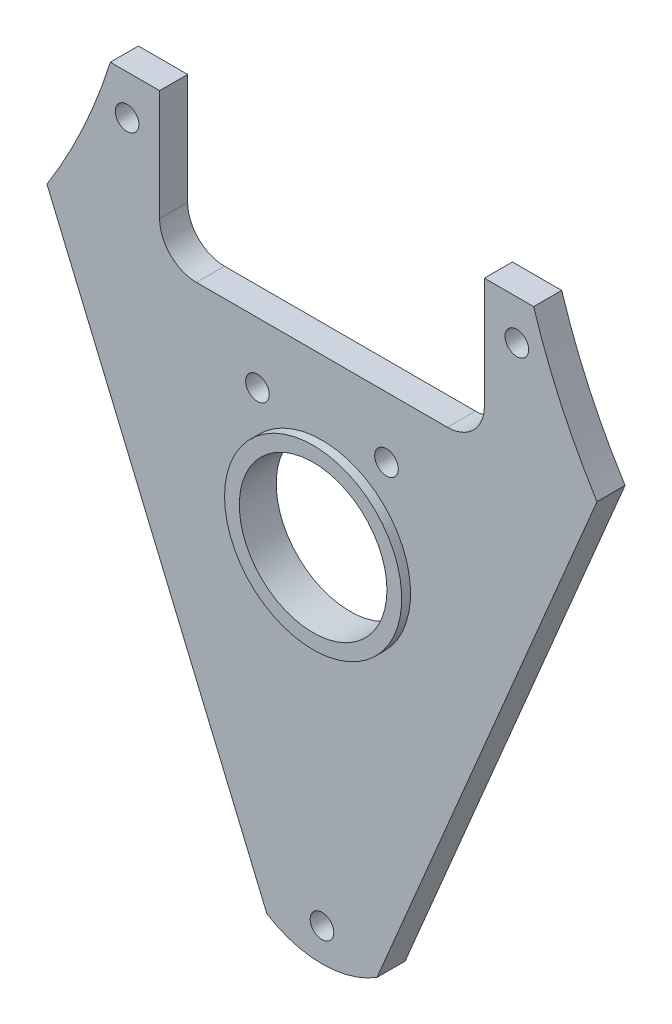
ISO-10303-21;
HEADER;
FILE_DESCRIPTION(('STEP AP214'),'2;1');
FILE_NAME('part.step','',(''),(''),'','','');
FILE_SCHEMA(('AUTOMOTIVE_DESIGN { 1 0 10303 214 1 1 1 1 }'));
ENDSEC;
DATA;
#1=APPLICATION_CONTEXT('core data for automotive mechanical design processes');
#2=APPLICATION_PROTOCOL_DEFINITION('international standard','automotive_design',2000,#1);
#3=PRODUCT_CONTEXT('',#1,'mechanical');
#4=PRODUCT('Part','Part','',(#3));
#5=PRODUCT_RELATED_PRODUCT_CATEGORY('part','',(#4));
#6=PRODUCT_DEFINITION_FORMATION('','',#4);
#7=PRODUCT_DEFINITION_CONTEXT('part definition',#1,'design');
#8=PRODUCT_DEFINITION('design','',#6,#7);
#9=PRODUCT_DEFINITION_SHAPE('','',#8);
#10=(LENGTH_UNIT() NAMED_UNIT(*) SI_UNIT(.MILLI.,.METRE.));
#11=(NAMED_UNIT(*) PLANE_ANGLE_UNIT() SI_UNIT($,.RADIAN.));
#12=(NAMED_UNIT(*) SI_UNIT($,.STERADIAN.) SOLID_ANGLE_UNIT());
#13=UNCERTAINTY_MEASURE_WITH_UNIT(LENGTH_MEASURE(1.E-05),#10,'distance_accuracy_value','');
#14=(GEOMETRIC_REPRESENTATION_CONTEXT(3) GLOBAL_UNCERTAINTY_ASSIGNED_CONTEXT((#13)) GLOBAL_UNIT_ASSIGNED_CONTEXT((#10,
#11,#12)) REPRESENTATION_CONTEXT('',''));
#15=CARTESIAN_POINT('',(0.,0.,0.));
#16=DIRECTION('',(0.,0.,1.));
#17=DIRECTION('',(1.,0.,0.));
#18=AXIS2_PLACEMENT_3D('',#15,#16,#17);
#19=CARTESIAN_POINT('',(0.,0.,2.413));
#20=DIRECTION('',(0.,0.,1.));
#21=DIRECTION('',(1.,0.,0.));
#22=AXIS2_PLACEMENT_3D('',#19,#20,#21);
#23=PLANE('',#22);
#24=CARTESIAN_POINT('',(-16.764,23.241,2.413));
#25=DIRECTION('',(0.,0.,1.));
#26=DIRECTION('',(1.,0.,0.));
#27=AXIS2_PLACEMENT_3D('',#24,#25,#26);
#28=CIRCLE('',#27,1.016);
#29=CARTESIAN_POINT('',(-15.748,23.241,2.413));
#30=VERTEX_POINT('',#29);
#31=EDGE_CURVE('E235',#30,#30,#28,.T.);
#32=ORIENTED_EDGE('',*,*,#31,.F.);
#33=EDGE_LOOP('',(#32));
#34=FACE_BOUND('',#33,.T.);
#35=CARTESIAN_POINT('',(5.5499,8.7376,2.413));
#36=DIRECTION('',(0.,0.,1.));
#37=DIRECTION('',(1.,0.,0.));
#38=AXIS2_PLACEMENT_3D('',#35,#36,#37);
#39=CIRCLE('',#38,1.016);
#40=CARTESIAN_POINT('',(6.5659,8.7376,2.413));
#41=VERTEX_POINT('',#40);
#42=EDGE_CURVE('E256',#41,#41,#39,.T.);
#43=ORIENTED_EDGE('',*,*,#42,.F.);
#44=EDGE_LOOP('',(#43));
#45=FACE_BOUND('',#44,.T.);
#46=CARTESIAN_POINT('',(-5.5499,8.7376,2.413));
#47=DIRECTION('',(0.,0.,1.));
#48=DIRECTION('',(1.,0.,0.));
#49=AXIS2_PLACEMENT_3D('',#46,#47,#48);
#50=CIRCLE('',#49,1.016);
#51=CARTESIAN_POINT('',(-4.5339,8.7376,2.413));
#52=VERTEX_POINT('',#51);
#53=EDGE_CURVE('E253',#52,#52,#50,.T.);
#54=ORIENTED_EDGE('',*,*,#53,.F.);
#55=EDGE_LOOP('',(#54));
#56=FACE_BOUND('',#55,.T.);
#57=CARTESIAN_POINT('',(0.,-28.575,2.413));
#58=DIRECTION('',(0.,0.,1.));
#59=DIRECTION('',(1.,0.,0.));
#60=AXIS2_PLACEMENT_3D('',#57,#58,#59);
#61=CIRCLE('',#60,1.016);
#62=CARTESIAN_POINT('',(1.016,-28.575,2.413));
#63=VERTEX_POINT('',#62);
#64=EDGE_CURVE('E249',#63,#63,#61,.T.);
#65=ORIENTED_EDGE('',*,*,#64,.F.);
#66=EDGE_LOOP('',(#65));
#67=FACE_BOUND('',#66,.T.);
#68=CARTESIAN_POINT('',(16.764,23.241,2.413));
#69=DIRECTION('',(0.,0.,1.));
#70=DIRECTION('',(1.,0.,0.));
#71=AXIS2_PLACEMENT_3D('',#68,#69,#70);
#72=CIRCLE('',#71,1.016);
#73=CARTESIAN_POINT('',(17.78,23.241,2.413));
#74=VERTEX_POINT('',#73);
#75=EDGE_CURVE('E252',#74,#74,#72,.T.);
#76=ORIENTED_EDGE('',*,*,#75,.F.);
#77=EDGE_LOOP('',(#76));
#78=FACE_BOUND('',#77,.T.);
#79=CARTESIAN_POINT('',(0.,0.,2.413));
#80=DIRECTION('',(0.,0.,1.));
#81=DIRECTION('',(1.,0.,0.));
#82=AXIS2_PLACEMENT_3D('',#79,#80,#81);
#83=CIRCLE('',#82,7.62);
#84=CARTESIAN_POINT('',(-7.62,0.,2.413));
#85=VERTEX_POINT('',#84);
#86=EDGE_CURVE('E226',#85,#85,#83,.T.);
#87=ORIENTED_EDGE('',*,*,#86,.F.);
#88=EDGE_LOOP('',(#87));
#89=FACE_BOUND('',#88,.T.);
#90=DIRECTION('',(0.,1.,0.));
#91=VECTOR('',#90,1.);
#92=CARTESIAN_POINT('',(-13.97,0.,2.413));
#93=LINE('',#92,#91);
#94=CARTESIAN_POINT('',(-13.97,17.145,2.413));
#95=VERTEX_POINT('',#94);
#96=CARTESIAN_POINT('',(-13.97,26.67,2.413));
#97=VERTEX_POINT('',#96);
#98=EDGE_CURVE('E173',#95,#97,#93,.T.);
#99=ORIENTED_EDGE('',*,*,#98,.T.);
#100=DIRECTION('',(-1.,0.,0.));
#101=VECTOR('',#100,1.);
#102=CARTESIAN_POINT('',(0.,26.67,2.413));
#103=LINE('',#102,#101);
#104=CARTESIAN_POINT('',(-18.2073286304664,26.67,2.413));
#105=VERTEX_POINT('',#104);
#106=EDGE_CURVE('E220',#97,#105,#103,.T.);
#107=ORIENTED_EDGE('',*,*,#106,.T.);
#108=CARTESIAN_POINT('',(-66.675,41.8859400634628,2.413));
#109=DIRECTION('',(0.,0.,1.));
#110=DIRECTION('',(1.,0.,0.));
#111=AXIS2_PLACEMENT_3D('',#108,#109,#110);
#112=CIRCLE('',#111,50.8);
#113=CARTESIAN_POINT('',(-23.6588709677419,14.8627529257449,2.413));
#114=VERTEX_POINT('',#113);
#115=EDGE_CURVE('E217',#105,#114,#112,.F.);
#116=ORIENTED_EDGE('',*,*,#115,.T.);
#117=DIRECTION('',(0.388341695242072,-0.921515451707954,0.));
#118=VECTOR('',#117,1.);
#119=CARTESIAN_POINT('',(-14.7720663961643,-6.22519057698116,2.413));
#120=LINE('',#119,#118);
#121=CARTESIAN_POINT('',(-4.73782513208841,-30.0359440559441,2.413));
#122=VERTEX_POINT('',#121);
#123=EDGE_CURVE('E214',#114,#122,#120,.T.);
#124=ORIENTED_EDGE('',*,*,#123,.T.);
#125=CARTESIAN_POINT('',(0.,-22.5136363636364,2.413));
#126=DIRECTION('',(0.,0.,1.));
#127=DIRECTION('',(1.,0.,0.));
#128=AXIS2_PLACEMENT_3D('',#125,#126,#127);
#129=CIRCLE('',#128,8.88999999999999);
#130=CARTESIAN_POINT('',(4.7378251320884,-30.0359440559441,2.413));
#131=VERTEX_POINT('',#130);
#132=EDGE_CURVE('E211',#122,#131,#129,.T.);
#133=ORIENTED_EDGE('',*,*,#132,.T.);
#134=DIRECTION('',(0.388341695242072,0.921515451707954,0.));
#135=VECTOR('',#134,1.);
#136=CARTESIAN_POINT('',(14.7720663961643,-6.22519057698116,2.413));
#137=LINE('',#136,#135);
#138=CARTESIAN_POINT('',(23.6588709677419,14.8627529257449,2.413));
#139=VERTEX_POINT('',#138);
#140=EDGE_CURVE('E208',#131,#139,#137,.T.);
#141=ORIENTED_EDGE('',*,*,#140,.T.);
#142=CARTESIAN_POINT('',(66.675,41.8859400634628,2.413));
#143=DIRECTION('',(0.,0.,1.));
#144=DIRECTION('',(1.,0.,0.));
#145=AXIS2_PLACEMENT_3D('',#142,#143,#144);
#146=CIRCLE('',#145,50.8);
#147=CARTESIAN_POINT('',(18.2073286304664,26.67,2.413));
#148=VERTEX_POINT('',#147);
#149=EDGE_CURVE('E205',#139,#148,#146,.F.);
#150=ORIENTED_EDGE('',*,*,#149,.T.);
#151=DIRECTION('',(-1.,0.,0.));
#152=VECTOR('',#151,1.);
#153=CARTESIAN_POINT('',(0.,26.67,2.413));
#154=LINE('',#153,#152);
#155=CARTESIAN_POINT('',(13.97,26.67,2.413));
#156=VERTEX_POINT('',#155);
#157=EDGE_CURVE('E202',#148,#156,#154,.T.);
#158=ORIENTED_EDGE('',*,*,#157,.T.);
#159=DIRECTION('',(0.,-1.,0.));
#160=VECTOR('',#159,1.);
#161=CARTESIAN_POINT('',(13.97,0.,2.413));
#162=LINE('',#161,#160);
#163=CARTESIAN_POINT('',(13.97,17.145,2.413));
#164=VERTEX_POINT('',#163);
#165=EDGE_CURVE('E199',#156,#164,#162,.T.);
#166=ORIENTED_EDGE('',*,*,#165,.T.);
#167=CARTESIAN_POINT('',(10.795,17.145,2.413));
#168=DIRECTION('',(0.,0.,1.));
#169=DIRECTION('',(1.,0.,0.));
#170=AXIS2_PLACEMENT_3D('',#167,#168,#169);
#171=CIRCLE('',#170,3.175);
#172=CARTESIAN_POINT('',(10.795,13.97,2.413));
#173=VERTEX_POINT('',#172);
#174=EDGE_CURVE('E196',#164,#173,#171,.F.);
#175=ORIENTED_EDGE('',*,*,#174,.T.);
#176=DIRECTION('',(-1.,0.,0.));
#177=VECTOR('',#176,1.);
#178=CARTESIAN_POINT('',(0.,13.97,2.413));
#179=LINE('',#178,#177);
#180=CARTESIAN_POINT('',(-10.795,13.97,2.413));
#181=VERTEX_POINT('',#180);
#182=EDGE_CURVE('E194',#173,#181,#179,.T.);
#183=ORIENTED_EDGE('',*,*,#182,.T.);
#184=CARTESIAN_POINT('',(-10.795,17.145,2.413));
#185=DIRECTION('',(0.,0.,1.));
#186=DIRECTION('',(1.,0.,0.));
#187=AXIS2_PLACEMENT_3D('',#184,#185,#186);
#188=CIRCLE('',#187,3.175);
#189=EDGE_CURVE('E126',#181,#95,#188,.F.);
#190=ORIENTED_EDGE('',*,*,#189,.T.);
#191=EDGE_LOOP('',(#99,#107,#116,#124,#133,#141,#150,#158,#166,#175,#183,#190));
#192=FACE_BOUND('',#191,.T.);
#193=ADVANCED_FACE('F32',(#34,#45,#56,#67,#78,#89,#192),#23,.T.);
#194=CARTESIAN_POINT('',(0.,0.,0.));
#195=DIRECTION('',(0.,0.,1.));
#196=DIRECTION('',(1.,0.,0.));
#197=AXIS2_PLACEMENT_3D('',#194,#195,#196);
#198=PLANE('',#197);
#199=CARTESIAN_POINT('',(-16.764,23.241,0.));
#200=DIRECTION('',(0.,0.,1.));
#201=DIRECTION('',(1.,0.,0.));
#202=AXIS2_PLACEMENT_3D('',#199,#200,#201);
#203=CIRCLE('',#202,1.016);
#204=CARTESIAN_POINT('',(-15.748,23.241,0.));
#205=VERTEX_POINT('',#204);
#206=EDGE_CURVE('E36',#205,#205,#203,.T.);
#207=ORIENTED_EDGE('',*,*,#206,.T.);
#208=EDGE_LOOP('',(#207));
#209=FACE_BOUND('',#208,.T.);
#210=CARTESIAN_POINT('',(5.5499,8.7376,0.));
#211=DIRECTION('',(0.,0.,1.));
#212=DIRECTION('',(1.,0.,0.));
#213=AXIS2_PLACEMENT_3D('',#210,#211,#212);
#214=CIRCLE('',#213,1.016);
#215=CARTESIAN_POINT('',(6.5659,8.7376,0.));
#216=VERTEX_POINT('',#215);
#217=EDGE_CURVE('E240',#216,#216,#214,.T.);
#218=ORIENTED_EDGE('',*,*,#217,.T.);
#219=EDGE_LOOP('',(#218));
#220=FACE_BOUND('',#219,.T.);
#221=CARTESIAN_POINT('',(-5.5499,8.7376,0.));
#222=DIRECTION('',(0.,0.,1.));
#223=DIRECTION('',(1.,0.,0.));
#224=AXIS2_PLACEMENT_3D('',#221,#222,#223);
#225=CIRCLE('',#224,1.016);
#226=CARTESIAN_POINT('',(-4.5339,8.7376,0.));
#227=VERTEX_POINT('',#226);
#228=EDGE_CURVE('E238',#227,#227,#225,.T.);
#229=ORIENTED_EDGE('',*,*,#228,.T.);
#230=EDGE_LOOP('',(#229));
#231=FACE_BOUND('',#230,.T.);
#232=CARTESIAN_POINT('',(0.,-28.575,0.));
#233=DIRECTION('',(0.,0.,1.));
#234=DIRECTION('',(1.,0.,0.));
#235=AXIS2_PLACEMENT_3D('',#232,#233,#234);
#236=CIRCLE('',#235,1.016);
#237=CARTESIAN_POINT('',(1.016,-28.575,0.));
#238=VERTEX_POINT('',#237);
#239=EDGE_CURVE('E234',#238,#238,#236,.T.);
#240=ORIENTED_EDGE('',*,*,#239,.T.);
#241=EDGE_LOOP('',(#240));
#242=FACE_BOUND('',#241,.T.);
#243=CARTESIAN_POINT('',(16.764,23.241,0.));
#244=DIRECTION('',(0.,0.,1.));
#245=DIRECTION('',(1.,0.,0.));
#246=AXIS2_PLACEMENT_3D('',#243,#244,#245);
#247=CIRCLE('',#246,1.016);
#248=CARTESIAN_POINT('',(17.78,23.241,0.));
#249=VERTEX_POINT('',#248);
#250=EDGE_CURVE('E231',#249,#249,#247,.T.);
#251=ORIENTED_EDGE('',*,*,#250,.T.);
#252=EDGE_LOOP('',(#251));
#253=FACE_BOUND('',#252,.T.);
#254=CARTESIAN_POINT('',(0.,0.,0.));
#255=DIRECTION('',(0.,0.,1.));
#256=DIRECTION('',(1.,0.,0.));
#257=AXIS2_PLACEMENT_3D('',#254,#255,#256);
#258=CIRCLE('',#257,6.35);
#259=CARTESIAN_POINT('',(6.35,0.,0.));
#260=VERTEX_POINT('',#259);
#261=EDGE_CURVE('E11',#260,#260,#258,.T.);
#262=ORIENTED_EDGE('',*,*,#261,.T.);
#263=EDGE_LOOP('',(#262));
#264=FACE_BOUND('',#263,.T.);
#265=DIRECTION('',(1.,0.,0.));
#266=VECTOR('',#265,1.);
#267=CARTESIAN_POINT('',(-13.97,26.67,0.));
#268=LINE('',#267,#266);
#269=CARTESIAN_POINT('',(-18.2073286304664,26.67,0.));
#270=VERTEX_POINT('',#269);
#271=CARTESIAN_POINT('',(-13.97,26.67,0.));
#272=VERTEX_POINT('',#271);
#273=EDGE_CURVE('E145',#270,#272,#268,.T.);
#274=ORIENTED_EDGE('',*,*,#273,.T.);
#275=DIRECTION('',(0.,-1.,0.));
#276=VECTOR('',#275,1.);
#277=CARTESIAN_POINT('',(-13.97,17.145,0.));
#278=LINE('',#277,#276);
#279=CARTESIAN_POINT('',(-13.97,17.145,0.));
#280=VERTEX_POINT('',#279);
#281=EDGE_CURVE('E143',#272,#280,#278,.T.);
#282=ORIENTED_EDGE('',*,*,#281,.T.);
#283=CARTESIAN_POINT('',(-10.795,17.145,0.));
#284=DIRECTION('',(0.,0.,1.));
#285=DIRECTION('',(-1.,0.,0.));
#286=AXIS2_PLACEMENT_3D('',#283,#284,#285);
#287=CIRCLE('',#286,3.175);
#288=CARTESIAN_POINT('',(-10.795,13.97,0.));
#289=VERTEX_POINT('',#288);
#290=EDGE_CURVE('E57',#280,#289,#287,.T.);
#291=ORIENTED_EDGE('',*,*,#290,.T.);
#292=DIRECTION('',(1.,0.,0.));
#293=VECTOR('',#292,1.);
#294=CARTESIAN_POINT('',(-10.795,13.97,0.));
#295=LINE('',#294,#293);
#296=CARTESIAN_POINT('',(10.795,13.97,0.));
#297=VERTEX_POINT('',#296);
#298=EDGE_CURVE('E133',#289,#297,#295,.T.);
#299=ORIENTED_EDGE('',*,*,#298,.T.);
#300=CARTESIAN_POINT('',(10.795,17.145,0.));
#301=DIRECTION('',(0.,0.,1.));
#302=DIRECTION('',(1.,0.,0.));
#303=AXIS2_PLACEMENT_3D('',#300,#301,#302);
#304=CIRCLE('',#303,3.175);
#305=CARTESIAN_POINT('',(13.97,17.145,0.));
#306=VERTEX_POINT('',#305);
#307=EDGE_CURVE('E139',#297,#306,#304,.T.);
#308=ORIENTED_EDGE('',*,*,#307,.T.);
#309=DIRECTION('',(0.,1.,0.));
#310=VECTOR('',#309,1.);
#311=CARTESIAN_POINT('',(13.97,17.145,0.));
#312=LINE('',#311,#310);
#313=CARTESIAN_POINT('',(13.97,26.67,0.));
#314=VERTEX_POINT('',#313);
#315=EDGE_CURVE('E150',#306,#314,#312,.T.);
#316=ORIENTED_EDGE('',*,*,#315,.T.);
#317=DIRECTION('',(1.,0.,0.));
#318=VECTOR('',#317,1.);
#319=CARTESIAN_POINT('',(13.97,26.67,0.));
#320=LINE('',#319,#318);
#321=CARTESIAN_POINT('',(18.2073286304664,26.67,0.));
#322=VERTEX_POINT('',#321);
#323=EDGE_CURVE('E153',#314,#322,#320,.T.);
#324=ORIENTED_EDGE('',*,*,#323,.T.);
#325=CARTESIAN_POINT('',(66.675,41.8859400634628,0.));
#326=DIRECTION('',(0.,0.,1.));
#327=DIRECTION('',(1.,0.,0.));
#328=AXIS2_PLACEMENT_3D('',#325,#326,#327);
#329=CIRCLE('',#328,50.8);
#330=CARTESIAN_POINT('',(23.6588709677419,14.8627529257449,0.));
#331=VERTEX_POINT('',#330);
#332=EDGE_CURVE('E156',#322,#331,#329,.T.);
#333=ORIENTED_EDGE('',*,*,#332,.T.);
#334=DIRECTION('',(-0.388341695242072,-0.921515451707954,0.));
#335=VECTOR('',#334,1.);
#336=CARTESIAN_POINT('',(23.6588709677419,14.8627529257449,0.));
#337=LINE('',#336,#335);
#338=CARTESIAN_POINT('',(4.7378251320884,-30.0359440559441,0.));
#339=VERTEX_POINT('',#338);
#340=EDGE_CURVE('E159',#331,#339,#337,.T.);
#341=ORIENTED_EDGE('',*,*,#340,.T.);
#342=CARTESIAN_POINT('',(0.,-22.5136363636364,0.));
#343=DIRECTION('',(0.,0.,-1.));
#344=DIRECTION('',(-1.,0.,0.));
#345=AXIS2_PLACEMENT_3D('',#342,#343,#344);
#346=CIRCLE('',#345,8.88999999999999);
#347=CARTESIAN_POINT('',(-4.73782513208841,-30.0359440559441,0.));
#348=VERTEX_POINT('',#347);
#349=EDGE_CURVE('E162',#339,#348,#346,.T.);
#350=ORIENTED_EDGE('',*,*,#349,.T.);
#351=DIRECTION('',(-0.388341695242072,0.921515451707954,0.));
#352=VECTOR('',#351,1.);
#353=CARTESIAN_POINT('',(-23.6588709677419,14.8627529257449,0.));
#354=LINE('',#353,#352);
#355=CARTESIAN_POINT('',(-23.6588709677419,14.8627529257449,0.));
#356=VERTEX_POINT('',#355);
#357=EDGE_CURVE('E165',#348,#356,#354,.T.);
#358=ORIENTED_EDGE('',*,*,#357,.T.);
#359=CARTESIAN_POINT('',(-66.675,41.8859400634628,0.));
#360=DIRECTION('',(0.,0.,1.));
#361=DIRECTION('',(-1.,0.,0.));
#362=AXIS2_PLACEMENT_3D('',#359,#360,#361);
#363=CIRCLE('',#362,50.8);
#364=EDGE_CURVE('E168',#356,#270,#363,.T.);
#365=ORIENTED_EDGE('',*,*,#364,.T.);
#366=EDGE_LOOP('',(#274,#282,#291,#299,#308,#316,#324,#333,#341,#350,#358,#365));
#367=FACE_BOUND('',#366,.T.);
#368=ADVANCED_FACE('F34',(#209,#220,#231,#242,#253,#264,#367),#198,.F.);
#369=CARTESIAN_POINT('',(0.,0.,2.413));
#370=DIRECTION('',(0.,0.,-1.));
#371=DIRECTION('',(-1.,0.,0.));
#372=AXIS2_PLACEMENT_3D('',#369,#370,#371);
#373=CYLINDRICAL_SURFACE('',#372,6.35);
#374=ORIENTED_EDGE('',*,*,#261,.F.);
#375=EDGE_LOOP('',(#374));
#376=FACE_BOUND('',#375,.T.);
#377=CARTESIAN_POINT('',(0.,0.,3.175));
#378=DIRECTION('',(0.,0.,1.));
#379=DIRECTION('',(1.,0.,0.));
#380=AXIS2_PLACEMENT_3D('',#377,#378,#379);
#381=CIRCLE('',#380,6.35);
#382=CARTESIAN_POINT('',(6.35,0.,3.175));
#383=VERTEX_POINT('',#382);
#384=EDGE_CURVE('E223',#383,#383,#381,.T.);
#385=ORIENTED_EDGE('',*,*,#384,.T.);
#386=EDGE_LOOP('',(#385));
#387=FACE_BOUND('',#386,.T.);
#388=ADVANCED_FACE('F302',(#376,#387),#373,.F.);
#389=CARTESIAN_POINT('',(0.,0.,3.175));
#390=DIRECTION('',(0.,0.,1.));
#391=DIRECTION('',(1.,0.,0.));
#392=AXIS2_PLACEMENT_3D('',#389,#390,#391);
#393=PLANE('',#392);
#394=CARTESIAN_POINT('',(0.,0.,3.175));
#395=DIRECTION('',(0.,0.,1.));
#396=DIRECTION('',(1.,0.,0.));
#397=AXIS2_PLACEMENT_3D('',#394,#395,#396);
#398=CIRCLE('',#397,7.62);
#399=CARTESIAN_POINT('',(-7.62,0.,3.175));
#400=VERTEX_POINT('',#399);
#401=EDGE_CURVE('E41',#400,#400,#398,.T.);
#402=ORIENTED_EDGE('',*,*,#401,.T.);
#403=EDGE_LOOP('',(#402));
#404=FACE_BOUND('',#403,.T.);
#405=ORIENTED_EDGE('',*,*,#384,.F.);
#406=EDGE_LOOP('',(#405));
#407=FACE_BOUND('',#406,.T.);
#408=ADVANCED_FACE('F299',(#404,#407),#393,.T.);
#409=CARTESIAN_POINT('',(0.,0.,3.175));
#410=DIRECTION('',(0.,0.,-1.));
#411=DIRECTION('',(-1.,0.,0.));
#412=AXIS2_PLACEMENT_3D('',#409,#410,#411);
#413=CYLINDRICAL_SURFACE('',#412,7.62);
#414=CARTESIAN_POINT('',(-7.62,0.,3.175));
#415=CARTESIAN_POINT('',(-7.62,0.,3.1670625));
#416=CARTESIAN_POINT('',(-7.62,0.,3.159125));
#417=CARTESIAN_POINT('',(-7.62,0.,3.14325));
#418=CARTESIAN_POINT('',(-7.62,0.,3.1353125));
#419=CARTESIAN_POINT('',(-7.62,0.,3.1194375));
#420=CARTESIAN_POINT('',(-7.62,0.,3.1115));
#421=CARTESIAN_POINT('',(-7.62,0.,3.095625));
#422=CARTESIAN_POINT('',(-7.62,0.,3.0876875));
#423=CARTESIAN_POINT('',(-7.62,0.,3.0718125));
#424=CARTESIAN_POINT('',(-7.62,0.,3.063875));
#425=CARTESIAN_POINT('',(-7.62,0.,3.048));
#426=CARTESIAN_POINT('',(-7.62,0.,3.0400625));
#427=CARTESIAN_POINT('',(-7.62,0.,3.0241875));
#428=CARTESIAN_POINT('',(-7.62,0.,3.01625));
#429=CARTESIAN_POINT('',(-7.62,0.,3.000375));
#430=CARTESIAN_POINT('',(-7.62,0.,2.9924375));
#431=CARTESIAN_POINT('',(-7.62,0.,2.9765625));
#432=CARTESIAN_POINT('',(-7.62,0.,2.968625));
#433=CARTESIAN_POINT('',(-7.62,0.,2.95275));
#434=CARTESIAN_POINT('',(-7.62,0.,2.9448125));
#435=CARTESIAN_POINT('',(-7.62,0.,2.9289375));
#436=CARTESIAN_POINT('',(-7.62,0.,2.921));
#437=CARTESIAN_POINT('',(-7.62,0.,2.905125));
#438=CARTESIAN_POINT('',(-7.62,0.,2.8971875));
#439=CARTESIAN_POINT('',(-7.62,0.,2.8813125));
#440=CARTESIAN_POINT('',(-7.62,0.,2.873375));
#441=CARTESIAN_POINT('',(-7.62,0.,2.8575));
#442=CARTESIAN_POINT('',(-7.62,0.,2.8495625));
#443=CARTESIAN_POINT('',(-7.62,0.,2.8336875));
#444=CARTESIAN_POINT('',(-7.62,0.,2.82575));
#445=CARTESIAN_POINT('',(-7.62,0.,2.809875));
#446=CARTESIAN_POINT('',(-7.62,0.,2.8019375));
#447=CARTESIAN_POINT('',(-7.62,0.,2.7860625));
#448=CARTESIAN_POINT('',(-7.62,0.,2.778125));
#449=CARTESIAN_POINT('',(-7.62,0.,2.76225));
#450=CARTESIAN_POINT('',(-7.62,0.,2.7543125));
#451=CARTESIAN_POINT('',(-7.62,0.,2.7384375));
#452=CARTESIAN_POINT('',(-7.62,0.,2.7305));
#453=CARTESIAN_POINT('',(-7.62,0.,2.714625));
#454=CARTESIAN_POINT('',(-7.62,0.,2.7066875));
#455=CARTESIAN_POINT('',(-7.62,0.,2.6908125));
#456=CARTESIAN_POINT('',(-7.62,0.,2.682875));
#457=CARTESIAN_POINT('',(-7.62,0.,2.667));
#458=CARTESIAN_POINT('',(-7.62,0.,2.6590625));
#459=CARTESIAN_POINT('',(-7.62,0.,2.6431875));
#460=CARTESIAN_POINT('',(-7.62,0.,2.63525));
#461=CARTESIAN_POINT('',(-7.62,0.,2.619375));
#462=CARTESIAN_POINT('',(-7.62,0.,2.6114375));
#463=CARTESIAN_POINT('',(-7.62,0.,2.5955625));
#464=CARTESIAN_POINT('',(-7.62,0.,2.587625));
#465=CARTESIAN_POINT('',(-7.62,0.,2.57175));
#466=CARTESIAN_POINT('',(-7.62,0.,2.5638125));
#467=CARTESIAN_POINT('',(-7.62,0.,2.5479375));
#468=CARTESIAN_POINT('',(-7.62,0.,2.54));
#469=CARTESIAN_POINT('',(-7.62,0.,2.524125));
#470=CARTESIAN_POINT('',(-7.62,0.,2.5161875));
#471=CARTESIAN_POINT('',(-7.62,0.,2.5003125));
#472=CARTESIAN_POINT('',(-7.62,0.,2.492375));
#473=CARTESIAN_POINT('',(-7.62,0.,2.4765));
#474=CARTESIAN_POINT('',(-7.62,0.,2.4685625));
#475=CARTESIAN_POINT('',(-7.62,0.,2.4526875));
#476=CARTESIAN_POINT('',(-7.62,0.,2.44475));
#477=CARTESIAN_POINT('',(-7.62,0.,2.428875));
#478=CARTESIAN_POINT('',(-7.62,0.,2.4209375));
#479=CARTESIAN_POINT('',(-7.62,0.,2.413));
#480=B_SPLINE_CURVE_WITH_KNOTS('',3,(#414,#415,#416,#417,#418,#419,#420,#421,#422,#423,#424,
#425,#426,#427,#428,#429,#430,#431,#432,#433,#434,#435,#436,#437,#438,#439,#440,#441,#442,#443,
#444,#445,#446,#447,#448,#449,#450,#451,#452,#453,#454,#455,#456,#457,#458,#459,#460,#461,#462,
#463,#464,#465,#466,#467,#468,#469,#470,#471,#472,#473,#474,#475,#476,#477,#478,#479),
.UNSPECIFIED.,.F.,.F.,(4,2,2,2,2,2,2,2,2,2,2,2,2,2,2,2,2,2,2,2,2,2,2,2,2,2,2,2,2,2,2,2,4),(0.,
0.0238125,0.0476249999999999,0.0714374999999999,0.0952499999999998,0.1190625,0.142875,0.1666875,
0.1905,0.2143125,0.238125,0.2619375,0.28575,0.3095625,0.333375,0.3571875,0.381,0.4048125,
0.428625,0.4524375,0.47625,0.5000625,0.523875,0.5476875,0.5715,0.5953125,0.619125,0.6429375,
0.66675,0.6905625,0.714375,0.7381875,0.762),.UNSPECIFIED.);
#481=EDGE_CURVE('BSEAM297',#400,#85,#480,.T.);
#482=ORIENTED_EDGE('',*,*,#401,.F.);
#483=ORIENTED_EDGE('',*,*,#86,.T.);
#484=ORIENTED_EDGE('',*,*,#481,.T.);
#485=ORIENTED_EDGE('',*,*,#481,.F.);
#486=EDGE_LOOP('',(#482,#484,#483,#485));
#487=FACE_BOUND('',#486,.T.);
#488=ADVANCED_FACE('F297',(#487),#413,.T.);
#489=CARTESIAN_POINT('',(-13.97,26.67,93.98));
#490=DIRECTION('',(0.,1.,0.));
#491=DIRECTION('',(-1.,0.,0.));
#492=AXIS2_PLACEMENT_3D('',#489,#490,#491);
#493=PLANE('',#492);
#494=DIRECTION('',(0.,0.,-1.));
#495=VECTOR('',#494,1.);
#496=CARTESIAN_POINT('',(-13.97,26.67,93.98));
#497=LINE('',#496,#495);
#498=EDGE_CURVE('E49',#97,#272,#497,.T.);
#499=ORIENTED_EDGE('',*,*,#498,.T.);
#500=ORIENTED_EDGE('',*,*,#273,.F.);
#501=DIRECTION('',(0.,0.,-1.));
#502=VECTOR('',#501,1.);
#503=CARTESIAN_POINT('',(-18.2073286304664,26.67,93.98));
#504=LINE('',#503,#502);
#505=EDGE_CURVE('E171',#105,#270,#504,.T.);
#506=ORIENTED_EDGE('',*,*,#505,.F.);
#507=ORIENTED_EDGE('',*,*,#106,.F.);
#508=EDGE_LOOP('',(#499,#500,#506,#507));
#509=FACE_BOUND('',#508,.T.);
#510=ADVANCED_FACE('F293',(#509),#493,.T.);
#511=CARTESIAN_POINT('',(-66.675,41.8859400634628,93.98));
#512=DIRECTION('',(0.,0.,-1.));
#513=DIRECTION('',(-1.,0.,0.));
#514=AXIS2_PLACEMENT_3D('',#511,#512,#513);
#515=CYLINDRICAL_SURFACE('',#514,50.8);
#516=ORIENTED_EDGE('',*,*,#505,.T.);
#517=ORIENTED_EDGE('',*,*,#364,.F.);
#518=DIRECTION('',(0.,0.,-1.));
#519=VECTOR('',#518,1.);
#520=CARTESIAN_POINT('',(-23.6588709677419,14.8627529257449,93.98));
#521=LINE('',#520,#519);
#522=EDGE_CURVE('E174',#114,#356,#521,.T.);
#523=ORIENTED_EDGE('',*,*,#522,.F.);
#524=ORIENTED_EDGE('',*,*,#115,.F.);
#525=EDGE_LOOP('',(#516,#517,#523,#524));
#526=FACE_BOUND('',#525,.T.);
#527=ADVANCED_FACE('F296',(#526),#515,.F.);
#528=CARTESIAN_POINT('',(-23.6588709677419,14.8627529257449,93.98));
#529=DIRECTION('',(-0.921515451707954,-0.388341695242072,0.));
#530=DIRECTION('',(0.388341695242072,-0.921515451707954,0.));
#531=AXIS2_PLACEMENT_3D('',#528,#529,#530);
#532=PLANE('',#531);
#533=ORIENTED_EDGE('',*,*,#522,.T.);
#534=ORIENTED_EDGE('',*,*,#357,.F.);
#535=DIRECTION('',(0.,0.,-1.));
#536=VECTOR('',#535,1.);
#537=CARTESIAN_POINT('',(-4.73782513208841,-30.0359440559441,93.98));
#538=LINE('',#537,#536);
#539=EDGE_CURVE('E176',#122,#348,#538,.T.);
#540=ORIENTED_EDGE('',*,*,#539,.F.);
#541=ORIENTED_EDGE('',*,*,#123,.F.);
#542=EDGE_LOOP('',(#533,#534,#540,#541));
#543=FACE_BOUND('',#542,.T.);
#544=ADVANCED_FACE('F342',(#543),#532,.T.);
#545=CARTESIAN_POINT('',(0.,-22.5136363636364,93.98));
#546=DIRECTION('',(0.,0.,-1.));
#547=DIRECTION('',(-1.,0.,0.));
#548=AXIS2_PLACEMENT_3D('',#545,#546,#547);
#549=CYLINDRICAL_SURFACE('',#548,8.88999999999999);
#550=ORIENTED_EDGE('',*,*,#539,.T.);
#551=ORIENTED_EDGE('',*,*,#349,.F.);
#552=DIRECTION('',(0.,0.,-1.));
#553=VECTOR('',#552,1.);
#554=CARTESIAN_POINT('',(4.7378251320884,-30.0359440559441,93.98));
#555=LINE('',#554,#553);
#556=EDGE_CURVE('E178',#131,#339,#555,.T.);
#557=ORIENTED_EDGE('',*,*,#556,.F.);
#558=ORIENTED_EDGE('',*,*,#132,.F.);
#559=EDGE_LOOP('',(#550,#551,#557,#558));
#560=FACE_BOUND('',#559,.T.);
#561=ADVANCED_FACE('F346',(#560),#549,.T.);
#562=CARTESIAN_POINT('',(23.6588709677419,14.8627529257449,93.98));
#563=DIRECTION('',(0.921515451707954,-0.388341695242072,0.));
#564=DIRECTION('',(0.388341695242072,0.921515451707954,0.));
#565=AXIS2_PLACEMENT_3D('',#562,#563,#564);
#566=PLANE('',#565);
#567=ORIENTED_EDGE('',*,*,#556,.T.);
#568=ORIENTED_EDGE('',*,*,#340,.F.);
#569=DIRECTION('',(0.,0.,-1.));
#570=VECTOR('',#569,1.);
#571=CARTESIAN_POINT('',(23.6588709677419,14.8627529257449,93.98));
#572=LINE('',#571,#570);
#573=EDGE_CURVE('E180',#139,#331,#572,.T.);
#574=ORIENTED_EDGE('',*,*,#573,.F.);
#575=ORIENTED_EDGE('',*,*,#140,.F.);
#576=EDGE_LOOP('',(#567,#568,#574,#575));
#577=FACE_BOUND('',#576,.T.);
#578=ADVANCED_FACE('F350',(#577),#566,.T.);
#579=CARTESIAN_POINT('',(66.675,41.8859400634628,93.98));
#580=DIRECTION('',(0.,0.,-1.));
#581=DIRECTION('',(-1.,0.,0.));
#582=AXIS2_PLACEMENT_3D('',#579,#580,#581);
#583=CYLINDRICAL_SURFACE('',#582,50.8);
#584=ORIENTED_EDGE('',*,*,#573,.T.);
#585=ORIENTED_EDGE('',*,*,#332,.F.);
#586=DIRECTION('',(0.,0.,-1.));
#587=VECTOR('',#586,1.);
#588=CARTESIAN_POINT('',(18.2073286304664,26.67,93.98));
#589=LINE('',#588,#587);
#590=EDGE_CURVE('E182',#148,#322,#589,.T.);
#591=ORIENTED_EDGE('',*,*,#590,.F.);
#592=ORIENTED_EDGE('',*,*,#149,.F.);
#593=EDGE_LOOP('',(#584,#585,#591,#592));
#594=FACE_BOUND('',#593,.T.);
#595=ADVANCED_FACE('F354',(#594),#583,.F.);
#596=CARTESIAN_POINT('',(13.97,26.67,93.98));
#597=DIRECTION('',(0.,1.,0.));
#598=DIRECTION('',(-1.,0.,0.));
#599=AXIS2_PLACEMENT_3D('',#596,#597,#598);
#600=PLANE('',#599);
#601=ORIENTED_EDGE('',*,*,#590,.T.);
#602=ORIENTED_EDGE('',*,*,#323,.F.);
#603=DIRECTION('',(0.,0.,-1.));
#604=VECTOR('',#603,1.);
#605=CARTESIAN_POINT('',(13.97,26.67,93.98));
#606=LINE('',#605,#604);
#607=EDGE_CURVE('E184',#156,#314,#606,.T.);
#608=ORIENTED_EDGE('',*,*,#607,.F.);
#609=ORIENTED_EDGE('',*,*,#157,.F.);
#610=EDGE_LOOP('',(#601,#602,#608,#609));
#611=FACE_BOUND('',#610,.T.);
#612=ADVANCED_FACE('F358',(#611),#600,.T.);
#613=CARTESIAN_POINT('',(13.97,17.145,93.98));
#614=DIRECTION('',(-1.,0.,0.));
#615=DIRECTION('',(0.,-1.,0.));
#616=AXIS2_PLACEMENT_3D('',#613,#614,#615);
#617=PLANE('',#616);
#618=ORIENTED_EDGE('',*,*,#607,.T.);
#619=ORIENTED_EDGE('',*,*,#315,.F.);
#620=DIRECTION('',(0.,0.,-1.));
#621=VECTOR('',#620,1.);
#622=CARTESIAN_POINT('',(13.97,17.145,93.98));
#623=LINE('',#622,#621);
#624=EDGE_CURVE('E186',#164,#306,#623,.T.);
#625=ORIENTED_EDGE('',*,*,#624,.F.);
#626=ORIENTED_EDGE('',*,*,#165,.F.);
#627=EDGE_LOOP('',(#618,#619,#625,#626));
#628=FACE_BOUND('',#627,.T.);
#629=ADVANCED_FACE('F362',(#628),#617,.T.);
#630=CARTESIAN_POINT('',(10.795,17.145,93.98));
#631=DIRECTION('',(0.,0.,-1.));
#632=DIRECTION('',(-1.,0.,0.));
#633=AXIS2_PLACEMENT_3D('',#630,#631,#632);
#634=CYLINDRICAL_SURFACE('',#633,3.175);
#635=ORIENTED_EDGE('',*,*,#624,.T.);
#636=ORIENTED_EDGE('',*,*,#307,.F.);
#637=DIRECTION('',(0.,0.,-1.));
#638=VECTOR('',#637,1.);
#639=CARTESIAN_POINT('',(10.795,13.97,93.98));
#640=LINE('',#639,#638);
#641=EDGE_CURVE('E129',#173,#297,#640,.T.);
#642=ORIENTED_EDGE('',*,*,#641,.F.);
#643=ORIENTED_EDGE('',*,*,#174,.F.);
#644=EDGE_LOOP('',(#635,#636,#642,#643));
#645=FACE_BOUND('',#644,.T.);
#646=ADVANCED_FACE('F366',(#645),#634,.F.);
#647=CARTESIAN_POINT('',(-10.795,13.97,93.98));
#648=DIRECTION('',(0.,1.,0.));
#649=DIRECTION('',(0.,0.,1.));
#650=AXIS2_PLACEMENT_3D('',#647,#648,#649);
#651=PLANE('',#650);
#652=ORIENTED_EDGE('',*,*,#641,.T.);
#653=ORIENTED_EDGE('',*,*,#298,.F.);
#654=DIRECTION('',(0.,0.,-1.));
#655=VECTOR('',#654,1.);
#656=CARTESIAN_POINT('',(-10.795,13.97,93.98));
#657=LINE('',#656,#655);
#658=EDGE_CURVE('E122',#181,#289,#657,.T.);
#659=ORIENTED_EDGE('',*,*,#658,.F.);
#660=ORIENTED_EDGE('',*,*,#182,.F.);
#661=EDGE_LOOP('',(#652,#653,#659,#660));
#662=FACE_BOUND('',#661,.T.);
#663=ADVANCED_FACE('F134',(#662),#651,.T.);
#664=CARTESIAN_POINT('',(-10.795,17.145,93.98));
#665=DIRECTION('',(0.,0.,-1.));
#666=DIRECTION('',(-1.,0.,0.));
#667=AXIS2_PLACEMENT_3D('',#664,#665,#666);
#668=CYLINDRICAL_SURFACE('',#667,3.175);
#669=ORIENTED_EDGE('',*,*,#658,.T.);
#670=ORIENTED_EDGE('',*,*,#290,.F.);
#671=DIRECTION('',(0.,0.,-1.));
#672=VECTOR('',#671,1.);
#673=CARTESIAN_POINT('',(-13.97,17.145,93.98));
#674=LINE('',#673,#672);
#675=EDGE_CURVE('E130',#95,#280,#674,.T.);
#676=ORIENTED_EDGE('',*,*,#675,.F.);
#677=ORIENTED_EDGE('',*,*,#189,.F.);
#678=EDGE_LOOP('',(#669,#670,#676,#677));
#679=FACE_BOUND('',#678,.T.);
#680=ADVANCED_FACE('F124',(#679),#668,.F.);
#681=CARTESIAN_POINT('',(-13.97,17.145,93.98));
#682=DIRECTION('',(1.,0.,0.));
#683=DIRECTION('',(0.,1.,0.));
#684=AXIS2_PLACEMENT_3D('',#681,#682,#683);
#685=PLANE('',#684);
#686=ORIENTED_EDGE('',*,*,#675,.T.);
#687=ORIENTED_EDGE('',*,*,#281,.F.);
#688=ORIENTED_EDGE('',*,*,#498,.F.);
#689=ORIENTED_EDGE('',*,*,#98,.F.);
#690=EDGE_LOOP('',(#686,#687,#688,#689));
#691=FACE_BOUND('',#690,.T.);
#692=ADVANCED_FACE('F279',(#691),#685,.T.);
#693=CARTESIAN_POINT('',(16.764,23.241,-91.567));
#694=DIRECTION('',(0.,0.,1.));
#695=DIRECTION('',(1.,0.,0.));
#696=AXIS2_PLACEMENT_3D('',#693,#694,#695);
#697=CYLINDRICAL_SURFACE('',#696,1.016);
#698=ORIENTED_EDGE('',*,*,#75,.T.);
#699=EDGE_LOOP('',(#698));
#700=FACE_BOUND('',#699,.T.);
#701=ORIENTED_EDGE('',*,*,#250,.F.);
#702=EDGE_LOOP('',(#701));
#703=FACE_BOUND('',#702,.T.);
#704=ADVANCED_FACE('F281',(#700,#703),#697,.F.);
#705=CARTESIAN_POINT('',(0.,-28.575,-91.567));
#706=DIRECTION('',(0.,0.,1.));
#707=DIRECTION('',(1.,0.,0.));
#708=AXIS2_PLACEMENT_3D('',#705,#706,#707);
#709=CYLINDRICAL_SURFACE('',#708,1.016);
#710=ORIENTED_EDGE('',*,*,#64,.T.);
#711=EDGE_LOOP('',(#710));
#712=FACE_BOUND('',#711,.T.);
#713=ORIENTED_EDGE('',*,*,#239,.F.);
#714=EDGE_LOOP('',(#713));
#715=FACE_BOUND('',#714,.T.);
#716=ADVANCED_FACE('F287',(#712,#715),#709,.F.);
#717=CARTESIAN_POINT('',(-5.5499,8.7376,-91.567));
#718=DIRECTION('',(0.,0.,1.));
#719=DIRECTION('',(1.,0.,0.));
#720=AXIS2_PLACEMENT_3D('',#717,#718,#719);
#721=CYLINDRICAL_SURFACE('',#720,1.016);
#722=ORIENTED_EDGE('',*,*,#53,.T.);
#723=EDGE_LOOP('',(#722));
#724=FACE_BOUND('',#723,.T.);
#725=ORIENTED_EDGE('',*,*,#228,.F.);
#726=EDGE_LOOP('',(#725));
#727=FACE_BOUND('',#726,.T.);
#728=ADVANCED_FACE('F329',(#724,#727),#721,.F.);
#729=CARTESIAN_POINT('',(5.5499,8.7376,-91.567));
#730=DIRECTION('',(0.,0.,1.));
#731=DIRECTION('',(1.,0.,0.));
#732=AXIS2_PLACEMENT_3D('',#729,#730,#731);
#733=CYLINDRICAL_SURFACE('',#732,1.016);
#734=ORIENTED_EDGE('',*,*,#42,.T.);
#735=EDGE_LOOP('',(#734));
#736=FACE_BOUND('',#735,.T.);
#737=ORIENTED_EDGE('',*,*,#217,.F.);
#738=EDGE_LOOP('',(#737));
#739=FACE_BOUND('',#738,.T.);
#740=ADVANCED_FACE('F335',(#736,#739),#733,.F.);
#741=CARTESIAN_POINT('',(-16.764,23.241,-91.567));
#742=DIRECTION('',(0.,0.,1.));
#743=DIRECTION('',(1.,0.,0.));
#744=AXIS2_PLACEMENT_3D('',#741,#742,#743);
#745=CYLINDRICAL_SURFACE('',#744,1.016);
#746=ORIENTED_EDGE('',*,*,#31,.T.);
#747=EDGE_LOOP('',(#746));
#748=FACE_BOUND('',#747,.T.);
#749=ORIENTED_EDGE('',*,*,#206,.F.);
#750=EDGE_LOOP('',(#749));
#751=FACE_BOUND('',#750,.T.);
#752=ADVANCED_FACE('F264',(#748,#751),#745,.F.);
#753=CLOSED_SHELL('',(#193,#368,#388,#408,#488,#510,#527,#544,#561,#578,#595,#612,#629,#646,
#663,#680,#692,#704,#716,#728,#740,#752));
#754=MANIFOLD_SOLID_BREP('B2',#753);
#755=ADVANCED_BREP_SHAPE_REPRESENTATION('',(#18,#754),#14);
#756=SHAPE_DEFINITION_REPRESENTATION(#9,#755);
ENDSEC;
END-ISO-10303-21;
